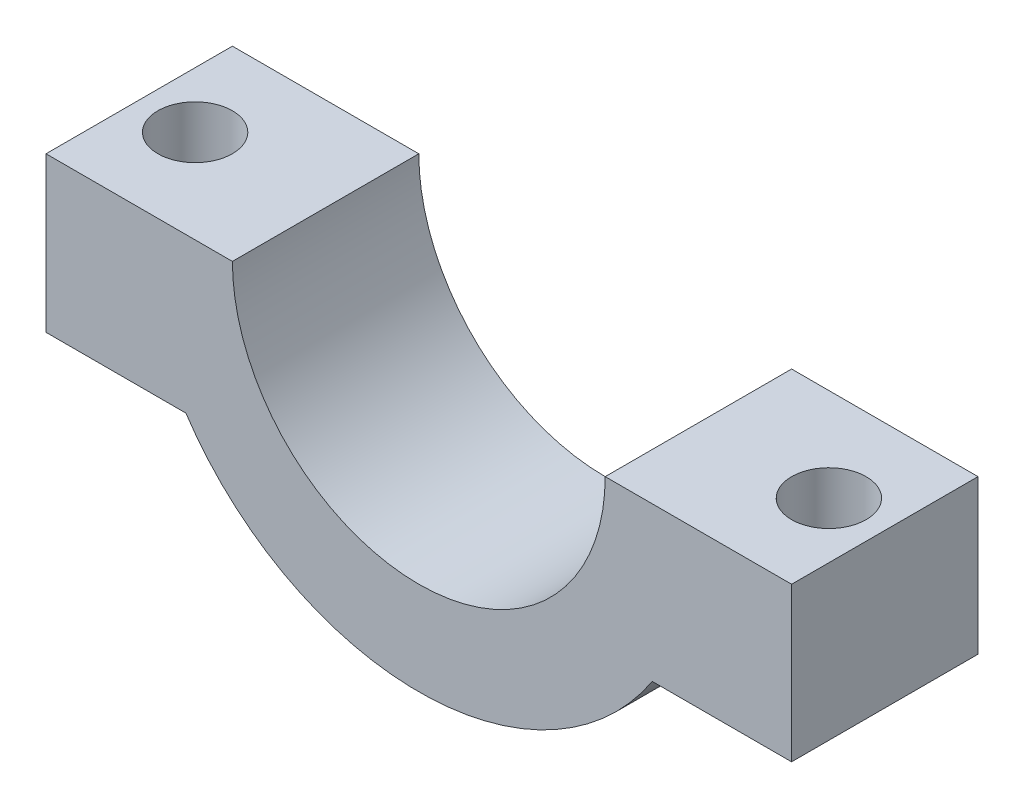
ISO-10303-21;
HEADER;
FILE_DESCRIPTION(('STEP AP214'),'2;1');
FILE_NAME('part.step','',(''),(''),'','','');
FILE_SCHEMA(('AUTOMOTIVE_DESIGN { 1 0 10303 214 1 1 1 1 }'));
ENDSEC;
DATA;
#1=APPLICATION_CONTEXT('core data for automotive mechanical design processes');
#2=APPLICATION_PROTOCOL_DEFINITION('international standard','automotive_design',2000,#1);
#3=PRODUCT_CONTEXT('',#1,'mechanical');
#4=PRODUCT('Part','Part','',(#3));
#5=PRODUCT_RELATED_PRODUCT_CATEGORY('part','',(#4));
#6=PRODUCT_DEFINITION_FORMATION('','',#4);
#7=PRODUCT_DEFINITION_CONTEXT('part definition',#1,'design');
#8=PRODUCT_DEFINITION('design','',#6,#7);
#9=PRODUCT_DEFINITION_SHAPE('','',#8);
#10=(LENGTH_UNIT() NAMED_UNIT(*) SI_UNIT(.MILLI.,.METRE.));
#11=(NAMED_UNIT(*) PLANE_ANGLE_UNIT() SI_UNIT($,.RADIAN.));
#12=(NAMED_UNIT(*) SI_UNIT($,.STERADIAN.) SOLID_ANGLE_UNIT());
#13=UNCERTAINTY_MEASURE_WITH_UNIT(LENGTH_MEASURE(1.E-05),#10,'distance_accuracy_value','');
#14=(GEOMETRIC_REPRESENTATION_CONTEXT(3) GLOBAL_UNCERTAINTY_ASSIGNED_CONTEXT((#13)) GLOBAL_UNIT_ASSIGNED_CONTEXT((#10,
#11,#12)) REPRESENTATION_CONTEXT('',''));
#15=CARTESIAN_POINT('',(0.,0.,0.));
#16=DIRECTION('',(0.,0.,1.));
#17=DIRECTION('',(1.,0.,0.));
#18=AXIS2_PLACEMENT_3D('',#15,#16,#17);
#19=CARTESIAN_POINT('',(0.,0.,10.));
#20=DIRECTION('',(0.,0.,-1.));
#21=DIRECTION('',(-1.,0.,0.));
#22=AXIS2_PLACEMENT_3D('',#19,#20,#21);
#23=CYLINDRICAL_SURFACE('',#22,10.);
#24=CARTESIAN_POINT('',(0.,0.,0.));
#25=DIRECTION('',(0.,0.,-1.));
#26=DIRECTION('',(1.,0.,0.));
#27=AXIS2_PLACEMENT_3D('',#24,#25,#26);
#28=CIRCLE('',#27,10.);
#29=CARTESIAN_POINT('',(10.,0.,0.));
#30=VERTEX_POINT('',#29);
#31=CARTESIAN_POINT('',(-10.,0.,0.));
#32=VERTEX_POINT('',#31);
#33=EDGE_CURVE('E133',#30,#32,#28,.T.);
#34=ORIENTED_EDGE('',*,*,#33,.T.);
#35=DIRECTION('',(0.,0.,-1.));
#36=VECTOR('',#35,1.);
#37=CARTESIAN_POINT('',(-10.,0.,10.));
#38=LINE('',#37,#36);
#39=CARTESIAN_POINT('',(-10.,0.,10.));
#40=VERTEX_POINT('',#39);
#41=EDGE_CURVE('E11',#40,#32,#38,.T.);
#42=ORIENTED_EDGE('',*,*,#41,.F.);
#43=CARTESIAN_POINT('',(0.,0.,10.));
#44=DIRECTION('',(0.,0.,-1.));
#45=DIRECTION('',(1.,0.,0.));
#46=AXIS2_PLACEMENT_3D('',#43,#44,#45);
#47=CIRCLE('',#46,10.);
#48=CARTESIAN_POINT('',(10.,0.,10.));
#49=VERTEX_POINT('',#48);
#50=EDGE_CURVE('E150',#49,#40,#47,.T.);
#51=ORIENTED_EDGE('',*,*,#50,.F.);
#52=DIRECTION('',(0.,0.,-1.));
#53=VECTOR('',#52,1.);
#54=CARTESIAN_POINT('',(10.,0.,10.));
#55=LINE('',#54,#53);
#56=EDGE_CURVE('E129',#49,#30,#55,.T.);
#57=ORIENTED_EDGE('',*,*,#56,.T.);
#58=EDGE_LOOP('',(#34,#42,#51,#57));
#59=FACE_BOUND('',#58,.T.);
#60=ADVANCED_FACE('F35',(#59),#23,.F.);
#61=CARTESIAN_POINT('',(-15.,0.,10.));
#62=DIRECTION('',(0.,-1.,0.));
#63=DIRECTION('',(1.,0.,0.));
#64=AXIS2_PLACEMENT_3D('',#61,#62,#63);
#65=PLANE('',#64);
#66=CARTESIAN_POINT('',(-17.,0.,5.));
#67=DIRECTION('',(0.,1.,0.));
#68=DIRECTION('',(0.,0.,1.));
#69=AXIS2_PLACEMENT_3D('',#66,#67,#68);
#70=CIRCLE('',#69,1.99999999999999);
#71=CARTESIAN_POINT('',(-17.,0.,6.99999999999999));
#72=VERTEX_POINT('',#71);
#73=EDGE_CURVE('E186',#72,#72,#70,.T.);
#74=ORIENTED_EDGE('',*,*,#73,.F.);
#75=EDGE_LOOP('',(#74));
#76=FACE_BOUND('',#75,.T.);
#77=DIRECTION('',(-1.,0.,0.));
#78=VECTOR('',#77,1.);
#79=CARTESIAN_POINT('',(-15.,0.,0.));
#80=LINE('',#79,#78);
#81=CARTESIAN_POINT('',(-20.,0.,0.));
#82=VERTEX_POINT('',#81);
#83=EDGE_CURVE('E136',#32,#82,#80,.T.);
#84=ORIENTED_EDGE('',*,*,#83,.T.);
#85=DIRECTION('',(0.,0.,-1.));
#86=VECTOR('',#85,1.);
#87=CARTESIAN_POINT('',(-20.,0.,10.));
#88=LINE('',#87,#86);
#89=CARTESIAN_POINT('',(-20.,0.,10.));
#90=VERTEX_POINT('',#89);
#91=EDGE_CURVE('E44',#90,#82,#88,.T.);
#92=ORIENTED_EDGE('',*,*,#91,.F.);
#93=DIRECTION('',(-1.,0.,0.));
#94=VECTOR('',#93,1.);
#95=CARTESIAN_POINT('',(-15.,0.,10.));
#96=LINE('',#95,#94);
#97=EDGE_CURVE('E93',#40,#90,#96,.T.);
#98=ORIENTED_EDGE('',*,*,#97,.F.);
#99=ORIENTED_EDGE('',*,*,#41,.T.);
#100=EDGE_LOOP('',(#84,#92,#98,#99));
#101=FACE_BOUND('',#100,.T.);
#102=ADVANCED_FACE('F204',(#76,#101),#65,.F.);
#103=CARTESIAN_POINT('',(-20.,0.,10.));
#104=DIRECTION('',(1.,0.,0.));
#105=DIRECTION('',(0.,0.,-1.));
#106=AXIS2_PLACEMENT_3D('',#103,#104,#105);
#107=PLANE('',#106);
#108=DIRECTION('',(0.,-1.,0.));
#109=VECTOR('',#108,1.);
#110=CARTESIAN_POINT('',(-20.,0.,0.));
#111=LINE('',#110,#109);
#112=CARTESIAN_POINT('',(-20.,-8.29702187657893,0.));
#113=VERTEX_POINT('',#112);
#114=EDGE_CURVE('E139',#82,#113,#111,.T.);
#115=ORIENTED_EDGE('',*,*,#114,.T.);
#116=DIRECTION('',(0.,0.,-1.));
#117=VECTOR('',#116,1.);
#118=CARTESIAN_POINT('',(-20.,-8.29702187657893,10.));
#119=LINE('',#118,#117);
#120=CARTESIAN_POINT('',(-20.,-8.29702187657893,10.));
#121=VERTEX_POINT('',#120);
#122=EDGE_CURVE('E157',#121,#113,#119,.T.);
#123=ORIENTED_EDGE('',*,*,#122,.F.);
#124=DIRECTION('',(0.,-1.,0.));
#125=VECTOR('',#124,1.);
#126=CARTESIAN_POINT('',(-20.,0.,10.));
#127=LINE('',#126,#125);
#128=EDGE_CURVE('E166',#90,#121,#127,.T.);
#129=ORIENTED_EDGE('',*,*,#128,.F.);
#130=ORIENTED_EDGE('',*,*,#91,.T.);
#131=EDGE_LOOP('',(#115,#123,#129,#130));
#132=FACE_BOUND('',#131,.T.);
#133=ADVANCED_FACE('F164',(#132),#107,.F.);
#134=CARTESIAN_POINT('',(-20.,-8.29702187657893,10.));
#135=DIRECTION('',(0.,1.,0.));
#136=DIRECTION('',(0.,0.,1.));
#137=AXIS2_PLACEMENT_3D('',#134,#135,#136);
#138=PLANE('',#137);
#139=CARTESIAN_POINT('',(-17.,-8.29702187657893,5.));
#140=DIRECTION('',(0.,1.,0.));
#141=DIRECTION('',(0.,0.,1.));
#142=AXIS2_PLACEMENT_3D('',#139,#140,#141);
#143=CIRCLE('',#142,1.99999999999999);
#144=CARTESIAN_POINT('',(-17.,-8.29702187657893,6.99999999999999));
#145=VERTEX_POINT('',#144);
#146=EDGE_CURVE('E38',#145,#145,#143,.T.);
#147=ORIENTED_EDGE('',*,*,#146,.T.);
#148=EDGE_LOOP('',(#147));
#149=FACE_BOUND('',#148,.T.);
#150=DIRECTION('',(1.,0.,0.));
#151=VECTOR('',#150,1.);
#152=CARTESIAN_POINT('',(-20.,-8.29702187657893,0.));
#153=LINE('',#152,#151);
#154=CARTESIAN_POINT('',(-12.49637659402,-8.29702187657893,0.));
#155=VERTEX_POINT('',#154);
#156=EDGE_CURVE('E141',#113,#155,#153,.T.);
#157=ORIENTED_EDGE('',*,*,#156,.T.);
#158=DIRECTION('',(0.,0.,-1.));
#159=VECTOR('',#158,1.);
#160=CARTESIAN_POINT('',(-12.49637659402,-8.29702187657893,10.));
#161=LINE('',#160,#159);
#162=CARTESIAN_POINT('',(-12.49637659402,-8.29702187657893,10.));
#163=VERTEX_POINT('',#162);
#164=EDGE_CURVE('E154',#163,#155,#161,.T.);
#165=ORIENTED_EDGE('',*,*,#164,.F.);
#166=DIRECTION('',(1.,0.,0.));
#167=VECTOR('',#166,1.);
#168=CARTESIAN_POINT('',(-20.,-8.29702187657893,10.));
#169=LINE('',#168,#167);
#170=EDGE_CURVE('E175',#121,#163,#169,.T.);
#171=ORIENTED_EDGE('',*,*,#170,.F.);
#172=ORIENTED_EDGE('',*,*,#122,.T.);
#173=EDGE_LOOP('',(#157,#165,#171,#172));
#174=FACE_BOUND('',#173,.T.);
#175=ADVANCED_FACE('F171',(#149,#174),#138,.F.);
#176=CARTESIAN_POINT('',(0.,0.,10.));
#177=DIRECTION('',(0.,0.,-1.));
#178=DIRECTION('',(-1.,0.,0.));
#179=AXIS2_PLACEMENT_3D('',#176,#177,#178);
#180=CYLINDRICAL_SURFACE('',#179,15.);
#181=CARTESIAN_POINT('',(0.,0.,0.));
#182=DIRECTION('',(0.,0.,1.));
#183=DIRECTION('',(1.,0.,0.));
#184=AXIS2_PLACEMENT_3D('',#181,#182,#183);
#185=CIRCLE('',#184,15.);
#186=CARTESIAN_POINT('',(12.5261203301476,-8.2520488046704,0.));
#187=VERTEX_POINT('',#186);
#188=EDGE_CURVE('E144',#155,#187,#185,.T.);
#189=ORIENTED_EDGE('',*,*,#188,.T.);
#190=DIRECTION('',(0.,0.,-1.));
#191=VECTOR('',#190,1.);
#192=CARTESIAN_POINT('',(12.5261203301476,-8.2520488046704,10.));
#193=LINE('',#192,#191);
#194=CARTESIAN_POINT('',(12.5261203301476,-8.2520488046704,10.));
#195=VERTEX_POINT('',#194);
#196=EDGE_CURVE('E124',#195,#187,#193,.T.);
#197=ORIENTED_EDGE('',*,*,#196,.F.);
#198=CARTESIAN_POINT('',(0.,0.,10.));
#199=DIRECTION('',(0.,0.,1.));
#200=DIRECTION('',(1.,0.,0.));
#201=AXIS2_PLACEMENT_3D('',#198,#199,#200);
#202=CIRCLE('',#201,15.);
#203=EDGE_CURVE('E113',#163,#195,#202,.T.);
#204=ORIENTED_EDGE('',*,*,#203,.F.);
#205=ORIENTED_EDGE('',*,*,#164,.T.);
#206=EDGE_LOOP('',(#189,#197,#204,#205));
#207=FACE_BOUND('',#206,.T.);
#208=ADVANCED_FACE('F174',(#207),#180,.T.);
#209=CARTESIAN_POINT('',(20.,-8.2520488046704,10.));
#210=DIRECTION('',(0.,1.,0.));
#211=DIRECTION('',(0.,0.,1.));
#212=AXIS2_PLACEMENT_3D('',#209,#210,#211);
#213=PLANE('',#212);
#214=CARTESIAN_POINT('',(17.,-8.2520488046704,5.));
#215=DIRECTION('',(0.,1.,0.));
#216=DIRECTION('',(0.,0.,1.));
#217=AXIS2_PLACEMENT_3D('',#214,#215,#216);
#218=CIRCLE('',#217,1.99999999999999);
#219=CARTESIAN_POINT('',(17.,-8.2520488046704,6.99999999999999));
#220=VERTEX_POINT('',#219);
#221=EDGE_CURVE('E137',#220,#220,#218,.T.);
#222=ORIENTED_EDGE('',*,*,#221,.T.);
#223=EDGE_LOOP('',(#222));
#224=FACE_BOUND('',#223,.T.);
#225=DIRECTION('',(1.,0.,0.));
#226=VECTOR('',#225,1.);
#227=CARTESIAN_POINT('',(20.,-8.2520488046704,0.));
#228=LINE('',#227,#226);
#229=CARTESIAN_POINT('',(20.,-8.2520488046704,0.));
#230=VERTEX_POINT('',#229);
#231=EDGE_CURVE('E122',#187,#230,#228,.T.);
#232=ORIENTED_EDGE('',*,*,#231,.T.);
#233=DIRECTION('',(0.,0.,-1.));
#234=VECTOR('',#233,1.);
#235=CARTESIAN_POINT('',(20.,-8.2520488046704,10.));
#236=LINE('',#235,#234);
#237=CARTESIAN_POINT('',(20.,-8.2520488046704,10.));
#238=VERTEX_POINT('',#237);
#239=EDGE_CURVE('E119',#238,#230,#236,.T.);
#240=ORIENTED_EDGE('',*,*,#239,.F.);
#241=DIRECTION('',(1.,0.,0.));
#242=VECTOR('',#241,1.);
#243=CARTESIAN_POINT('',(20.,-8.2520488046704,10.));
#244=LINE('',#243,#242);
#245=EDGE_CURVE('E106',#195,#238,#244,.T.);
#246=ORIENTED_EDGE('',*,*,#245,.F.);
#247=ORIENTED_EDGE('',*,*,#196,.T.);
#248=EDGE_LOOP('',(#232,#240,#246,#247));
#249=FACE_BOUND('',#248,.T.);
#250=ADVANCED_FACE('F120',(#224,#249),#213,.F.);
#251=CARTESIAN_POINT('',(20.,0.,10.));
#252=DIRECTION('',(-1.,0.,0.));
#253=DIRECTION('',(0.,0.,1.));
#254=AXIS2_PLACEMENT_3D('',#251,#252,#253);
#255=PLANE('',#254);
#256=DIRECTION('',(0.,1.,0.));
#257=VECTOR('',#256,1.);
#258=CARTESIAN_POINT('',(20.,0.,0.));
#259=LINE('',#258,#257);
#260=CARTESIAN_POINT('',(20.,0.,0.));
#261=VERTEX_POINT('',#260);
#262=EDGE_CURVE('E147',#230,#261,#259,.T.);
#263=ORIENTED_EDGE('',*,*,#262,.T.);
#264=DIRECTION('',(0.,0.,-1.));
#265=VECTOR('',#264,1.);
#266=CARTESIAN_POINT('',(20.,0.,10.));
#267=LINE('',#266,#265);
#268=CARTESIAN_POINT('',(20.,0.,10.));
#269=VERTEX_POINT('',#268);
#270=EDGE_CURVE('E125',#269,#261,#267,.T.);
#271=ORIENTED_EDGE('',*,*,#270,.F.);
#272=DIRECTION('',(0.,1.,0.));
#273=VECTOR('',#272,1.);
#274=CARTESIAN_POINT('',(20.,0.,10.));
#275=LINE('',#274,#273);
#276=EDGE_CURVE('E110',#238,#269,#275,.T.);
#277=ORIENTED_EDGE('',*,*,#276,.F.);
#278=ORIENTED_EDGE('',*,*,#239,.T.);
#279=EDGE_LOOP('',(#263,#271,#277,#278));
#280=FACE_BOUND('',#279,.T.);
#281=ADVANCED_FACE('F127',(#280),#255,.F.);
#282=CARTESIAN_POINT('',(10.,0.,10.));
#283=DIRECTION('',(0.,-1.,0.));
#284=DIRECTION('',(0.,0.,-1.));
#285=AXIS2_PLACEMENT_3D('',#282,#283,#284);
#286=PLANE('',#285);
#287=CARTESIAN_POINT('',(17.,0.,5.));
#288=DIRECTION('',(0.,1.,0.));
#289=DIRECTION('',(0.,0.,1.));
#290=AXIS2_PLACEMENT_3D('',#287,#288,#289);
#291=CIRCLE('',#290,1.99999999999999);
#292=CARTESIAN_POINT('',(17.,0.,6.99999999999999));
#293=VERTEX_POINT('',#292);
#294=EDGE_CURVE('E183',#293,#293,#291,.T.);
#295=ORIENTED_EDGE('',*,*,#294,.F.);
#296=EDGE_LOOP('',(#295));
#297=FACE_BOUND('',#296,.T.);
#298=DIRECTION('',(-1.,0.,0.));
#299=VECTOR('',#298,1.);
#300=CARTESIAN_POINT('',(10.,0.,0.));
#301=LINE('',#300,#299);
#302=EDGE_CURVE('E81',#261,#30,#301,.T.);
#303=ORIENTED_EDGE('',*,*,#302,.T.);
#304=ORIENTED_EDGE('',*,*,#56,.F.);
#305=DIRECTION('',(-1.,0.,0.));
#306=VECTOR('',#305,1.);
#307=CARTESIAN_POINT('',(15.,0.,10.));
#308=LINE('',#307,#306);
#309=EDGE_CURVE('E52',#269,#49,#308,.T.);
#310=ORIENTED_EDGE('',*,*,#309,.F.);
#311=ORIENTED_EDGE('',*,*,#270,.T.);
#312=EDGE_LOOP('',(#303,#304,#310,#311));
#313=FACE_BOUND('',#312,.T.);
#314=ADVANCED_FACE('F212',(#297,#313),#286,.F.);
#315=CARTESIAN_POINT('',(0.,0.,10.));
#316=DIRECTION('',(0.,0.,1.));
#317=DIRECTION('',(1.,0.,0.));
#318=AXIS2_PLACEMENT_3D('',#315,#316,#317);
#319=PLANE('',#318);
#320=ORIENTED_EDGE('',*,*,#50,.T.);
#321=ORIENTED_EDGE('',*,*,#97,.T.);
#322=ORIENTED_EDGE('',*,*,#128,.T.);
#323=ORIENTED_EDGE('',*,*,#170,.T.);
#324=ORIENTED_EDGE('',*,*,#203,.T.);
#325=ORIENTED_EDGE('',*,*,#245,.T.);
#326=ORIENTED_EDGE('',*,*,#276,.T.);
#327=ORIENTED_EDGE('',*,*,#309,.T.);
#328=EDGE_LOOP('',(#320,#321,#322,#323,#324,#325,#326,#327));
#329=FACE_BOUND('',#328,.T.);
#330=ADVANCED_FACE('F108',(#329),#319,.T.);
#331=CARTESIAN_POINT('',(0.,0.,0.));
#332=DIRECTION('',(0.,0.,1.));
#333=DIRECTION('',(1.,0.,0.));
#334=AXIS2_PLACEMENT_3D('',#331,#332,#333);
#335=PLANE('',#334);
#336=ORIENTED_EDGE('',*,*,#33,.F.);
#337=ORIENTED_EDGE('',*,*,#302,.F.);
#338=ORIENTED_EDGE('',*,*,#262,.F.);
#339=ORIENTED_EDGE('',*,*,#231,.F.);
#340=ORIENTED_EDGE('',*,*,#188,.F.);
#341=ORIENTED_EDGE('',*,*,#156,.F.);
#342=ORIENTED_EDGE('',*,*,#114,.F.);
#343=ORIENTED_EDGE('',*,*,#83,.F.);
#344=EDGE_LOOP('',(#336,#337,#338,#339,#340,#341,#342,#343));
#345=FACE_BOUND('',#344,.T.);
#346=ADVANCED_FACE('F168',(#345),#335,.F.);
#347=CARTESIAN_POINT('',(17.,0.,5.));
#348=DIRECTION('',(0.,1.,0.));
#349=DIRECTION('',(0.,0.,1.));
#350=AXIS2_PLACEMENT_3D('',#347,#348,#349);
#351=CYLINDRICAL_SURFACE('',#350,1.99999999999999);
#352=ORIENTED_EDGE('',*,*,#294,.T.);
#353=EDGE_LOOP('',(#352));
#354=FACE_BOUND('',#353,.T.);
#355=ORIENTED_EDGE('',*,*,#221,.F.);
#356=EDGE_LOOP('',(#355));
#357=FACE_BOUND('',#356,.T.);
#358=ADVANCED_FACE('F196',(#354,#357),#351,.F.);
#359=CARTESIAN_POINT('',(-17.,0.,5.));
#360=DIRECTION('',(0.,1.,0.));
#361=DIRECTION('',(0.,0.,1.));
#362=AXIS2_PLACEMENT_3D('',#359,#360,#361);
#363=CYLINDRICAL_SURFACE('',#362,1.99999999999999);
#364=ORIENTED_EDGE('',*,*,#73,.T.);
#365=EDGE_LOOP('',(#364));
#366=FACE_BOUND('',#365,.T.);
#367=ORIENTED_EDGE('',*,*,#146,.F.);
#368=EDGE_LOOP('',(#367));
#369=FACE_BOUND('',#368,.T.);
#370=ADVANCED_FACE('F194',(#366,#369),#363,.F.);
#371=CLOSED_SHELL('',(#60,#102,#133,#175,#208,#250,#281,#314,#330,#346,#358,#370));
#372=MANIFOLD_SOLID_BREP('B2',#371);
#373=ADVANCED_BREP_SHAPE_REPRESENTATION('',(#18,#372),#14);
#374=SHAPE_DEFINITION_REPRESENTATION(#9,#373);
ENDSEC;
END-ISO-10303-21;
